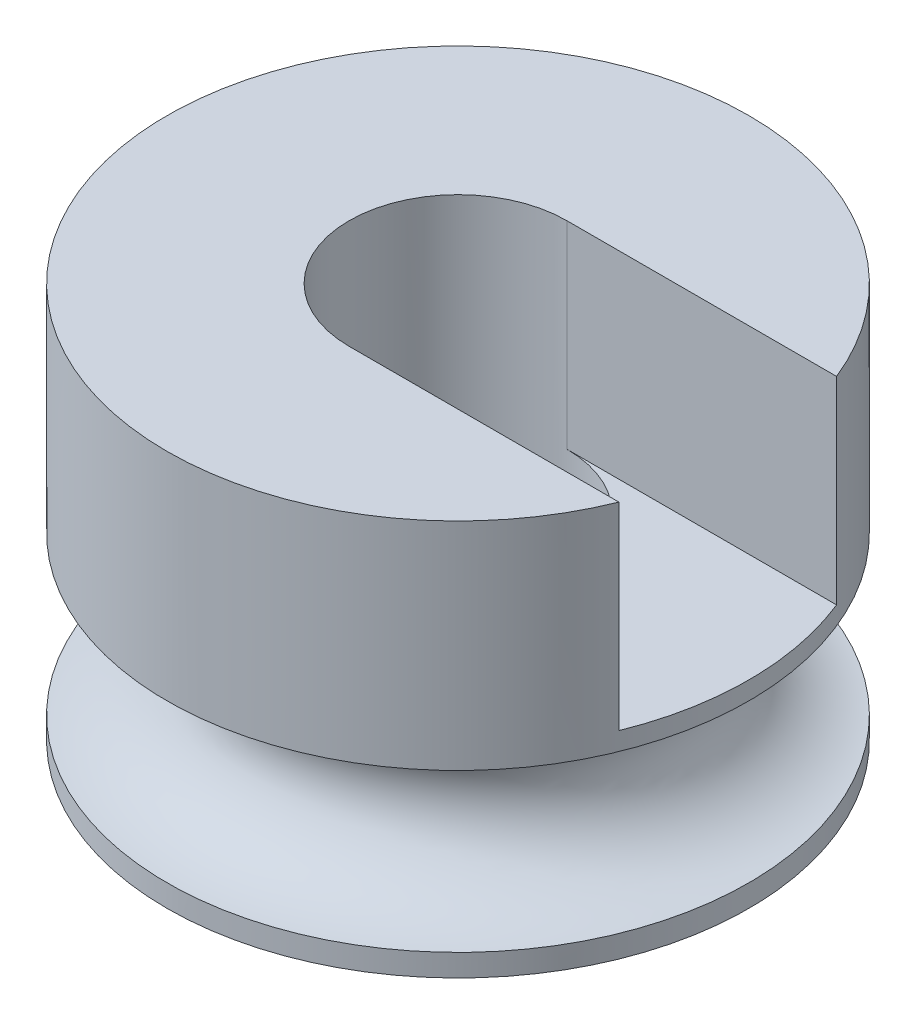
ISO-10303-21;
HEADER;
FILE_DESCRIPTION(('STEP AP214'),'2;1');
FILE_NAME('part.step','',(''),(''),'','','');
FILE_SCHEMA(('AUTOMOTIVE_DESIGN { 1 0 10303 214 1 1 1 1 }'));
ENDSEC;
DATA;
#1=APPLICATION_CONTEXT('core data for automotive mechanical design processes');
#2=APPLICATION_PROTOCOL_DEFINITION('international standard','automotive_design',2000,#1);
#3=PRODUCT_CONTEXT('',#1,'mechanical');
#4=PRODUCT('Part','Part','',(#3));
#5=PRODUCT_RELATED_PRODUCT_CATEGORY('part','',(#4));
#6=PRODUCT_DEFINITION_FORMATION('','',#4);
#7=PRODUCT_DEFINITION_CONTEXT('part definition',#1,'design');
#8=PRODUCT_DEFINITION('design','',#6,#7);
#9=PRODUCT_DEFINITION_SHAPE('','',#8);
#10=(LENGTH_UNIT() NAMED_UNIT(*) SI_UNIT(.MILLI.,.METRE.));
#11=(NAMED_UNIT(*) PLANE_ANGLE_UNIT() SI_UNIT($,.RADIAN.));
#12=(NAMED_UNIT(*) SI_UNIT($,.STERADIAN.) SOLID_ANGLE_UNIT());
#13=UNCERTAINTY_MEASURE_WITH_UNIT(LENGTH_MEASURE(1.E-05),#10,'distance_accuracy_value','');
#14=(GEOMETRIC_REPRESENTATION_CONTEXT(3) GLOBAL_UNCERTAINTY_ASSIGNED_CONTEXT((#13)) GLOBAL_UNIT_ASSIGNED_CONTEXT((#10,
#11,#12)) REPRESENTATION_CONTEXT('',''));
#15=CARTESIAN_POINT('',(0.,0.,0.));
#16=DIRECTION('',(0.,0.,1.));
#17=DIRECTION('',(1.,0.,0.));
#18=AXIS2_PLACEMENT_3D('',#15,#16,#17);
#19=CARTESIAN_POINT('',(0.,10.,0.));
#20=DIRECTION('',(0.,-1.,0.));
#21=DIRECTION('',(0.,0.,-1.));
#22=AXIS2_PLACEMENT_3D('',#19,#20,#21);
#23=CYLINDRICAL_SURFACE('',#22,7.35);
#24=CARTESIAN_POINT('',(0.,10.,0.));
#25=DIRECTION('',(0.,1.,0.));
#26=DIRECTION('',(0.,0.,1.));
#27=AXIS2_PLACEMENT_3D('',#24,#25,#26);
#28=CIRCLE('',#27,7.35);
#29=CARTESIAN_POINT('',(6.81615727518079,10.,-2.75));
#30=VERTEX_POINT('',#29);
#31=CARTESIAN_POINT('',(6.81615727518079,10.,2.75));
#32=VERTEX_POINT('',#31);
#33=EDGE_CURVE('E97',#30,#32,#28,.T.);
#34=ORIENTED_EDGE('',*,*,#33,.F.);
#35=DIRECTION('',(0.,-1.,0.));
#36=VECTOR('',#35,1.);
#37=CARTESIAN_POINT('',(6.81615727518079,10.,-2.75));
#38=LINE('',#37,#36);
#39=CARTESIAN_POINT('',(6.81615727518079,5.,-2.75));
#40=VERTEX_POINT('',#39);
#41=EDGE_CURVE('E89',#30,#40,#38,.T.);
#42=ORIENTED_EDGE('',*,*,#41,.T.);
#43=CARTESIAN_POINT('',(0.,5.,0.));
#44=DIRECTION('',(0.,1.,0.));
#45=DIRECTION('',(0.,0.,1.));
#46=AXIS2_PLACEMENT_3D('',#43,#44,#45);
#47=CIRCLE('',#46,7.35);
#48=CARTESIAN_POINT('',(6.81615727518079,5.,2.75));
#49=VERTEX_POINT('',#48);
#50=EDGE_CURVE('E11',#49,#40,#47,.T.);
#51=ORIENTED_EDGE('',*,*,#50,.F.);
#52=DIRECTION('',(0.,-1.,0.));
#53=VECTOR('',#52,1.);
#54=CARTESIAN_POINT('',(6.81615727518079,10.,2.75));
#55=LINE('',#54,#53);
#56=EDGE_CURVE('E81',#49,#32,#55,.F.);
#57=ORIENTED_EDGE('',*,*,#56,.T.);
#58=EDGE_LOOP('',(#34,#42,#51,#57));
#59=FACE_BOUND('',#58,.T.);
#60=CARTESIAN_POINT('',(0.,4.54076977294114,0.));
#61=DIRECTION('',(0.,-1.,0.));
#62=DIRECTION('',(0.,0.,-1.));
#63=AXIS2_PLACEMENT_3D('',#60,#61,#62);
#64=CIRCLE('',#63,7.35);
#65=CARTESIAN_POINT('',(0.,4.54076977294114,-7.35));
#66=VERTEX_POINT('',#65);
#67=EDGE_CURVE('E36',#66,#66,#64,.T.);
#68=ORIENTED_EDGE('',*,*,#67,.F.);
#69=EDGE_LOOP('',(#68));
#70=FACE_BOUND('',#69,.T.);
#71=ADVANCED_FACE('F33',(#59,#70),#23,.T.);
#72=CARTESIAN_POINT('',(0.,0.,0.));
#73=DIRECTION('',(0.,1.,0.));
#74=DIRECTION('',(0.,0.,1.));
#75=AXIS2_PLACEMENT_3D('',#72,#73,#74);
#76=CIRCLE('',#75,7.35);
#77=CARTESIAN_POINT('',(0.,0.,7.35));
#78=VERTEX_POINT('',#77);
#79=EDGE_CURVE('E98',#78,#78,#76,.T.);
#80=ORIENTED_EDGE('',*,*,#79,.T.);
#81=EDGE_LOOP('',(#80));
#82=FACE_BOUND('',#81,.T.);
#83=CARTESIAN_POINT('',(0.,0.560494595104561,0.));
#84=DIRECTION('',(0.,-1.,0.));
#85=DIRECTION('',(0.,0.,-1.));
#86=AXIS2_PLACEMENT_3D('',#83,#84,#85);
#87=CIRCLE('',#86,7.35);
#88=CARTESIAN_POINT('',(0.,0.560494595104561,-7.35));
#89=VERTEX_POINT('',#88);
#90=EDGE_CURVE('E110',#89,#89,#87,.F.);
#91=ORIENTED_EDGE('',*,*,#90,.F.);
#92=EDGE_LOOP('',(#91));
#93=FACE_BOUND('',#92,.T.);
#94=ADVANCED_FACE('F132',(#82,#93),#23,.T.);
#95=CARTESIAN_POINT('',(0.,10.,0.));
#96=DIRECTION('',(0.,1.,0.));
#97=DIRECTION('',(0.,0.,1.));
#98=AXIS2_PLACEMENT_3D('',#95,#96,#97);
#99=PLANE('',#98);
#100=DIRECTION('',(-1.,0.,0.));
#101=VECTOR('',#100,1.);
#102=CARTESIAN_POINT('',(0.,10.,-2.75));
#103=LINE('',#102,#101);
#104=CARTESIAN_POINT('',(0.,10.,-2.75));
#105=VERTEX_POINT('',#104);
#106=EDGE_CURVE('E41',#30,#105,#103,.T.);
#107=ORIENTED_EDGE('',*,*,#106,.F.);
#108=ORIENTED_EDGE('',*,*,#33,.T.);
#109=DIRECTION('',(1.,0.,0.));
#110=VECTOR('',#109,1.);
#111=CARTESIAN_POINT('',(0.,10.,2.75));
#112=LINE('',#111,#110);
#113=CARTESIAN_POINT('',(0.,10.,2.75));
#114=VERTEX_POINT('',#113);
#115=EDGE_CURVE('E85',#114,#32,#112,.T.);
#116=ORIENTED_EDGE('',*,*,#115,.F.);
#117=CARTESIAN_POINT('',(0.,10.,0.));
#118=DIRECTION('',(0.,1.,0.));
#119=DIRECTION('',(0.,0.,1.));
#120=AXIS2_PLACEMENT_3D('',#117,#118,#119);
#121=CIRCLE('',#120,2.75);
#122=EDGE_CURVE('E49',#105,#114,#121,.T.);
#123=ORIENTED_EDGE('',*,*,#122,.F.);
#124=EDGE_LOOP('',(#107,#108,#116,#123));
#125=FACE_BOUND('',#124,.T.);
#126=ADVANCED_FACE('F129',(#125),#99,.T.);
#127=CARTESIAN_POINT('',(0.,0.,0.));
#128=DIRECTION('',(0.,1.,0.));
#129=DIRECTION('',(0.,0.,1.));
#130=AXIS2_PLACEMENT_3D('',#127,#128,#129);
#131=PLANE('',#130);
#132=CARTESIAN_POINT('',(0.,0.,0.));
#133=DIRECTION('',(0.,1.,0.));
#134=DIRECTION('',(0.,0.,1.));
#135=AXIS2_PLACEMENT_3D('',#132,#133,#134);
#136=CIRCLE('',#135,2.75);
#137=CARTESIAN_POINT('',(0.,0.,2.75));
#138=VERTEX_POINT('',#137);
#139=EDGE_CURVE('E115',#138,#138,#136,.T.);
#140=ORIENTED_EDGE('',*,*,#139,.T.);
#141=EDGE_LOOP('',(#140));
#142=FACE_BOUND('',#141,.T.);
#143=ORIENTED_EDGE('',*,*,#79,.F.);
#144=EDGE_LOOP('',(#143));
#145=FACE_BOUND('',#144,.T.);
#146=ADVANCED_FACE('F131',(#142,#145),#131,.F.);
#147=CARTESIAN_POINT('',(0.,5.,0.));
#148=DIRECTION('',(0.,1.,0.));
#149=DIRECTION('',(0.,0.,1.));
#150=AXIS2_PLACEMENT_3D('',#147,#148,#149);
#151=PLANE('',#150);
#152=CARTESIAN_POINT('',(0.,5.,0.));
#153=DIRECTION('',(0.,1.,0.));
#154=DIRECTION('',(0.,0.,1.));
#155=AXIS2_PLACEMENT_3D('',#152,#153,#154);
#156=CIRCLE('',#155,2.75);
#157=CARTESIAN_POINT('',(0.,5.,2.75));
#158=VERTEX_POINT('',#157);
#159=CARTESIAN_POINT('',(0.,5.,-2.75));
#160=VERTEX_POINT('',#159);
#161=EDGE_CURVE('E74',#158,#160,#156,.T.);
#162=ORIENTED_EDGE('',*,*,#161,.F.);
#163=DIRECTION('',(1.,0.,0.));
#164=VECTOR('',#163,1.);
#165=CARTESIAN_POINT('',(0.,5.,2.75));
#166=LINE('',#165,#164);
#167=EDGE_CURVE('E83',#158,#49,#166,.T.);
#168=ORIENTED_EDGE('',*,*,#167,.T.);
#169=ORIENTED_EDGE('',*,*,#50,.T.);
#170=DIRECTION('',(-1.,0.,0.));
#171=VECTOR('',#170,1.);
#172=CARTESIAN_POINT('',(0.,5.,-2.75));
#173=LINE('',#172,#171);
#174=EDGE_CURVE('E93',#40,#160,#173,.T.);
#175=ORIENTED_EDGE('',*,*,#174,.T.);
#176=EDGE_LOOP('',(#162,#168,#169,#175));
#177=FACE_BOUND('',#176,.T.);
#178=ADVANCED_FACE('F92',(#177),#151,.T.);
#179=CARTESIAN_POINT('',(0.,5.,-2.75));
#180=DIRECTION('',(0.,0.,-1.));
#181=DIRECTION('',(-1.,0.,0.));
#182=AXIS2_PLACEMENT_3D('',#179,#180,#181);
#183=PLANE('',#182);
#184=ORIENTED_EDGE('',*,*,#106,.T.);
#185=DIRECTION('',(0.,1.,0.));
#186=VECTOR('',#185,1.);
#187=CARTESIAN_POINT('',(0.,5.,-2.75));
#188=LINE('',#187,#186);
#189=EDGE_CURVE('E90',#160,#105,#188,.T.);
#190=ORIENTED_EDGE('',*,*,#189,.F.);
#191=ORIENTED_EDGE('',*,*,#174,.F.);
#192=ORIENTED_EDGE('',*,*,#41,.F.);
#193=EDGE_LOOP('',(#184,#190,#191,#192));
#194=FACE_BOUND('',#193,.T.);
#195=ADVANCED_FACE('F125',(#194),#183,.F.);
#196=CARTESIAN_POINT('',(0.,5.,2.75));
#197=DIRECTION('',(0.,0.,1.));
#198=DIRECTION('',(1.,0.,0.));
#199=AXIS2_PLACEMENT_3D('',#196,#197,#198);
#200=PLANE('',#199);
#201=ORIENTED_EDGE('',*,*,#167,.F.);
#202=DIRECTION('',(0.,1.,0.));
#203=VECTOR('',#202,1.);
#204=CARTESIAN_POINT('',(0.,5.,2.75));
#205=LINE('',#204,#203);
#206=EDGE_CURVE('E107',#158,#114,#205,.T.);
#207=ORIENTED_EDGE('',*,*,#206,.T.);
#208=ORIENTED_EDGE('',*,*,#115,.T.);
#209=ORIENTED_EDGE('',*,*,#56,.F.);
#210=EDGE_LOOP('',(#201,#207,#208,#209));
#211=FACE_BOUND('',#210,.T.);
#212=ADVANCED_FACE('F82',(#211),#200,.F.);
#213=CARTESIAN_POINT('',(0.,5.,0.));
#214=DIRECTION('',(0.,1.,0.));
#215=DIRECTION('',(0.,0.,1.));
#216=AXIS2_PLACEMENT_3D('',#213,#214,#215);
#217=CYLINDRICAL_SURFACE('',#216,2.75);
#218=ORIENTED_EDGE('',*,*,#122,.T.);
#219=ORIENTED_EDGE('',*,*,#206,.F.);
#220=ORIENTED_EDGE('',*,*,#161,.T.);
#221=ORIENTED_EDGE('',*,*,#189,.T.);
#222=EDGE_LOOP('',(#218,#219,#220,#221));
#223=FACE_BOUND('',#222,.T.);
#224=ORIENTED_EDGE('',*,*,#139,.F.);
#225=EDGE_LOOP('',(#224));
#226=FACE_BOUND('',#225,.T.);
#227=ADVANCED_FACE('F126',(#223,#226),#217,.F.);
#228=CARTESIAN_POINT('',(-7.59796791997179,2.55063218402285,0.));
#229=DIRECTION('',(0.,0.,1.));
#230=DIRECTION('',(1.,0.,0.));
#231=AXIS2_PLACEMENT_3D('',#228,#229,#230);
#232=ELLIPSE('',#231,2.5,2.);
#233=CARTESIAN_POINT('',(0.,10.,0.));
#234=DIRECTION('',(0.,-1.,0.));
#235=AXIS1_PLACEMENT('',#233,#234);
#236=SURFACE_OF_REVOLUTION('',#232,#235);
#237=ORIENTED_EDGE('',*,*,#90,.T.);
#238=EDGE_LOOP('',(#237));
#239=FACE_BOUND('',#238,.T.);
#240=ORIENTED_EDGE('',*,*,#67,.T.);
#241=EDGE_LOOP('',(#240));
#242=FACE_BOUND('',#241,.T.);
#243=ADVANCED_FACE('F154',(#239,#242),#236,.F.);
#244=CLOSED_SHELL('',(#71,#94,#126,#146,#178,#195,#212,#227,#243));
#245=MANIFOLD_SOLID_BREP('B2',#244);
#246=ADVANCED_BREP_SHAPE_REPRESENTATION('',(#18,#245),#14);
#247=SHAPE_DEFINITION_REPRESENTATION(#9,#246);
ENDSEC;
END-ISO-10303-21;
